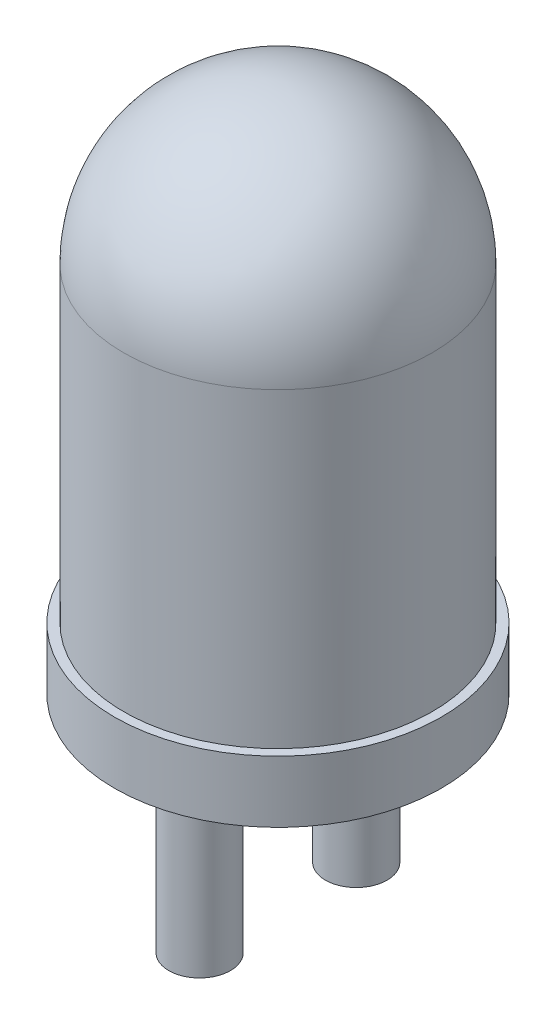
ISO-10303-21;
HEADER;
FILE_DESCRIPTION(('STEP AP214'),'2;1');
FILE_NAME('part.step','',(''),(''),'','','');
FILE_SCHEMA(('AUTOMOTIVE_DESIGN { 1 0 10303 214 1 1 1 1 }'));
ENDSEC;
DATA;
#1=APPLICATION_CONTEXT('core data for automotive mechanical design processes');
#2=APPLICATION_PROTOCOL_DEFINITION('international standard','automotive_design',2000,#1);
#3=PRODUCT_CONTEXT('',#1,'mechanical');
#4=PRODUCT('Part','Part','',(#3));
#5=PRODUCT_RELATED_PRODUCT_CATEGORY('part','',(#4));
#6=PRODUCT_DEFINITION_FORMATION('','',#4);
#7=PRODUCT_DEFINITION_CONTEXT('part definition',#1,'design');
#8=PRODUCT_DEFINITION('design','',#6,#7);
#9=PRODUCT_DEFINITION_SHAPE('','',#8);
#10=(LENGTH_UNIT() NAMED_UNIT(*) SI_UNIT(.MILLI.,.METRE.));
#11=(NAMED_UNIT(*) PLANE_ANGLE_UNIT() SI_UNIT($,.RADIAN.));
#12=(NAMED_UNIT(*) SI_UNIT($,.STERADIAN.) SOLID_ANGLE_UNIT());
#13=UNCERTAINTY_MEASURE_WITH_UNIT(LENGTH_MEASURE(1.E-05),#10,'distance_accuracy_value','');
#14=(GEOMETRIC_REPRESENTATION_CONTEXT(3) GLOBAL_UNCERTAINTY_ASSIGNED_CONTEXT((#13)) GLOBAL_UNIT_ASSIGNED_CONTEXT((#10,
#11,#12)) REPRESENTATION_CONTEXT('',''));
#15=CARTESIAN_POINT('',(0.,0.,0.));
#16=DIRECTION('',(0.,0.,1.));
#17=DIRECTION('',(1.,0.,0.));
#18=AXIS2_PLACEMENT_3D('',#15,#16,#17);
#19=CARTESIAN_POINT('',(0.,-4.,-1.27));
#20=DIRECTION('',(0.,-1.,0.));
#21=DIRECTION('',(0.,0.,-1.));
#22=AXIS2_PLACEMENT_3D('',#19,#20,#21);
#23=PLANE('',#22);
#24=CARTESIAN_POINT('',(0.,-4.,-1.27));
#25=DIRECTION('',(0.,1.,0.));
#26=DIRECTION('',(0.,0.,1.));
#27=AXIS2_PLACEMENT_3D('',#24,#25,#26);
#28=CIRCLE('',#27,0.5);
#29=CARTESIAN_POINT('',(0.,-4.,-0.77));
#30=VERTEX_POINT('',#29);
#31=EDGE_CURVE('E20',#30,#30,#28,.T.);
#32=ORIENTED_EDGE('',*,*,#31,.F.);
#33=EDGE_LOOP('',(#32));
#34=FACE_BOUND('',#33,.T.);
#35=ADVANCED_FACE('F17',(#34),#23,.T.);
#36=CARTESIAN_POINT('',(0.,-4.,1.27));
#37=DIRECTION('',(0.,-1.,0.));
#38=DIRECTION('',(0.,0.,-1.));
#39=AXIS2_PLACEMENT_3D('',#36,#37,#38);
#40=PLANE('',#39);
#41=CARTESIAN_POINT('',(0.,-4.,1.27));
#42=DIRECTION('',(0.,1.,0.));
#43=DIRECTION('',(0.,0.,1.));
#44=AXIS2_PLACEMENT_3D('',#41,#42,#43);
#45=CIRCLE('',#44,0.5);
#46=CARTESIAN_POINT('',(0.,-4.,1.77));
#47=VERTEX_POINT('',#46);
#48=EDGE_CURVE('E52',#47,#47,#45,.T.);
#49=ORIENTED_EDGE('',*,*,#48,.F.);
#50=EDGE_LOOP('',(#49));
#51=FACE_BOUND('',#50,.T.);
#52=ADVANCED_FACE('F62',(#51),#40,.T.);
#53=CARTESIAN_POINT('',(0.,-4.,-1.27));
#54=DIRECTION('',(0.,1.,0.));
#55=DIRECTION('',(0.,0.,1.));
#56=AXIS2_PLACEMENT_3D('',#53,#54,#55);
#57=CYLINDRICAL_SURFACE('',#56,0.5);
#58=CARTESIAN_POINT('',(0.,-1.,-1.27));
#59=DIRECTION('',(0.,1.,0.));
#60=DIRECTION('',(0.,0.,1.));
#61=AXIS2_PLACEMENT_3D('',#58,#59,#60);
#62=CIRCLE('',#61,0.5);
#63=CARTESIAN_POINT('',(0.,-1.,-0.77));
#64=VERTEX_POINT('',#63);
#65=EDGE_CURVE('E50',#64,#64,#62,.T.);
#66=ORIENTED_EDGE('',*,*,#65,.F.);
#67=EDGE_LOOP('',(#66));
#68=FACE_BOUND('',#67,.T.);
#69=ORIENTED_EDGE('',*,*,#31,.T.);
#70=EDGE_LOOP('',(#69));
#71=FACE_BOUND('',#70,.T.);
#72=ADVANCED_FACE('F59',(#68,#71),#57,.T.);
#73=CARTESIAN_POINT('',(0.,-4.,1.27));
#74=DIRECTION('',(0.,1.,0.));
#75=DIRECTION('',(0.,0.,1.));
#76=AXIS2_PLACEMENT_3D('',#73,#74,#75);
#77=CYLINDRICAL_SURFACE('',#76,0.5);
#78=CARTESIAN_POINT('',(0.,-1.,1.27));
#79=DIRECTION('',(0.,1.,0.));
#80=DIRECTION('',(0.,0.,1.));
#81=AXIS2_PLACEMENT_3D('',#78,#79,#80);
#82=CIRCLE('',#81,0.5);
#83=CARTESIAN_POINT('',(0.,-1.,1.77));
#84=VERTEX_POINT('',#83);
#85=EDGE_CURVE('E47',#84,#84,#82,.T.);
#86=ORIENTED_EDGE('',*,*,#85,.F.);
#87=EDGE_LOOP('',(#86));
#88=FACE_BOUND('',#87,.T.);
#89=ORIENTED_EDGE('',*,*,#48,.T.);
#90=EDGE_LOOP('',(#89));
#91=FACE_BOUND('',#90,.T.);
#92=ADVANCED_FACE('F87',(#88,#91),#77,.T.);
#93=CARTESIAN_POINT('',(0.,-1.,0.));
#94=DIRECTION('',(0.,-1.,0.));
#95=DIRECTION('',(0.,0.,-1.));
#96=AXIS2_PLACEMENT_3D('',#93,#94,#95);
#97=PLANE('',#96);
#98=CARTESIAN_POINT('',(0.,-1.,0.));
#99=DIRECTION('',(0.,1.,0.));
#100=DIRECTION('',(0.,0.,1.));
#101=AXIS2_PLACEMENT_3D('',#98,#99,#100);
#102=CIRCLE('',#101,2.65);
#103=CARTESIAN_POINT('',(0.,-1.,2.65));
#104=VERTEX_POINT('',#103);
#105=EDGE_CURVE('E44',#104,#104,#102,.T.);
#106=ORIENTED_EDGE('',*,*,#105,.F.);
#107=EDGE_LOOP('',(#106));
#108=FACE_BOUND('',#107,.T.);
#109=ORIENTED_EDGE('',*,*,#85,.T.);
#110=EDGE_LOOP('',(#109));
#111=FACE_BOUND('',#110,.T.);
#112=ORIENTED_EDGE('',*,*,#65,.T.);
#113=EDGE_LOOP('',(#112));
#114=FACE_BOUND('',#113,.T.);
#115=ADVANCED_FACE('F83',(#108,#111,#114),#97,.T.);
#116=CARTESIAN_POINT('',(0.,-1.,0.));
#117=DIRECTION('',(0.,1.,0.));
#118=DIRECTION('',(0.,0.,1.));
#119=AXIS2_PLACEMENT_3D('',#116,#117,#118);
#120=CYLINDRICAL_SURFACE('',#119,2.65);
#121=ORIENTED_EDGE('',*,*,#105,.T.);
#122=EDGE_LOOP('',(#121));
#123=FACE_BOUND('',#122,.T.);
#124=CARTESIAN_POINT('',(0.,0.,0.));
#125=DIRECTION('',(0.,1.,0.));
#126=DIRECTION('',(0.,0.,1.));
#127=AXIS2_PLACEMENT_3D('',#124,#125,#126);
#128=CIRCLE('',#127,2.65);
#129=CARTESIAN_POINT('',(0.,0.,2.65));
#130=VERTEX_POINT('',#129);
#131=EDGE_CURVE('E36',#130,#130,#128,.F.);
#132=ORIENTED_EDGE('',*,*,#131,.T.);
#133=EDGE_LOOP('',(#132));
#134=FACE_BOUND('',#133,.T.);
#135=ADVANCED_FACE('F79',(#123,#134),#120,.T.);
#136=CARTESIAN_POINT('',(0.,5.04,0.));
#137=DIRECTION('',(1.,0.,0.));
#138=DIRECTION('',(0.,0.,-1.));
#139=AXIS2_PLACEMENT_3D('',#136,#137,#138);
#140=SPHERICAL_SURFACE('',#139,2.5);
#141=CARTESIAN_POINT('',(0.,5.04,0.));
#142=DIRECTION('',(0.,-1.,0.));
#143=DIRECTION('',(0.,0.,-1.));
#144=AXIS2_PLACEMENT_3D('',#141,#142,#143);
#145=CIRCLE('',#144,2.5);
#146=CARTESIAN_POINT('',(-2.5,5.04,0.));
#147=VERTEX_POINT('',#146);
#148=CARTESIAN_POINT('',(2.5,5.04,0.));
#149=VERTEX_POINT('',#148);
#150=EDGE_CURVE('E33',#147,#149,#145,.T.);
#151=ORIENTED_EDGE('',*,*,#150,.F.);
#152=CARTESIAN_POINT('',(0.,5.04,0.));
#153=DIRECTION('',(0.,-1.,0.));
#154=DIRECTION('',(0.,0.,-1.));
#155=AXIS2_PLACEMENT_3D('',#152,#153,#154);
#156=CIRCLE('',#155,2.5);
#157=EDGE_CURVE('E25',#149,#147,#156,.T.);
#158=ORIENTED_EDGE('',*,*,#157,.F.);
#159=EDGE_LOOP('',(#151,#158));
#160=FACE_BOUND('',#159,.T.);
#161=ADVANCED_FACE('F38',(#160),#140,.T.);
#162=CARTESIAN_POINT('',(0.,0.,0.));
#163=DIRECTION('',(0.,-1.,0.));
#164=DIRECTION('',(0.,0.,-1.));
#165=AXIS2_PLACEMENT_3D('',#162,#163,#164);
#166=PLANE('',#165);
#167=ORIENTED_EDGE('',*,*,#131,.F.);
#168=EDGE_LOOP('',(#167));
#169=FACE_BOUND('',#168,.T.);
#170=CARTESIAN_POINT('',(0.,0.,0.));
#171=DIRECTION('',(0.,-1.,0.));
#172=DIRECTION('',(0.,0.,-1.));
#173=AXIS2_PLACEMENT_3D('',#170,#171,#172);
#174=CIRCLE('',#173,2.5);
#175=CARTESIAN_POINT('',(0.,0.,-2.5));
#176=VERTEX_POINT('',#175);
#177=EDGE_CURVE('E10',#176,#176,#174,.F.);
#178=ORIENTED_EDGE('',*,*,#177,.F.);
#179=EDGE_LOOP('',(#178));
#180=FACE_BOUND('',#179,.T.);
#181=ADVANCED_FACE('F68',(#169,#180),#166,.F.);
#182=CARTESIAN_POINT('',(0.,0.,0.));
#183=DIRECTION('',(0.,-1.,0.));
#184=DIRECTION('',(0.,0.,-1.));
#185=AXIS2_PLACEMENT_3D('',#182,#183,#184);
#186=CYLINDRICAL_SURFACE('',#185,2.5);
#187=ORIENTED_EDGE('',*,*,#177,.T.);
#188=EDGE_LOOP('',(#187));
#189=FACE_BOUND('',#188,.T.);
#190=ORIENTED_EDGE('',*,*,#157,.T.);
#191=ORIENTED_EDGE('',*,*,#150,.T.);
#192=EDGE_LOOP('',(#190,#191));
#193=FACE_BOUND('',#192,.T.);
#194=ADVANCED_FACE('F34',(#189,#193),#186,.T.);
#195=CLOSED_SHELL('',(#35,#52,#72,#92,#115,#135,#161,#181,#194));
#196=MANIFOLD_SOLID_BREP('B1',#195);
#197=ADVANCED_BREP_SHAPE_REPRESENTATION('',(#18,#196),#14);
#198=SHAPE_DEFINITION_REPRESENTATION(#9,#197);
ENDSEC;
END-ISO-10303-21;
